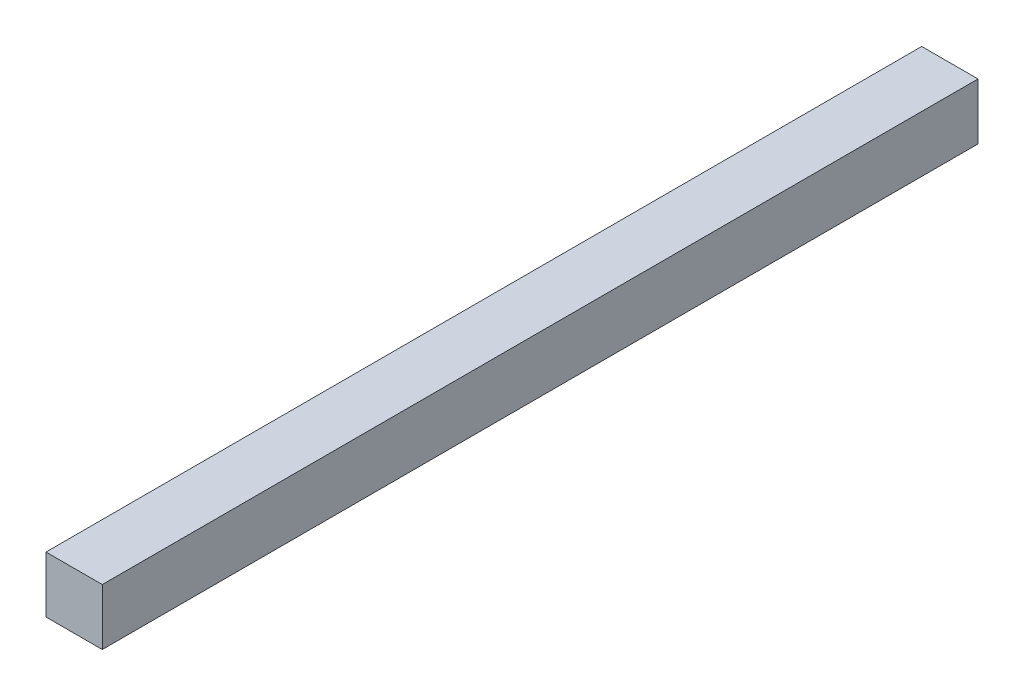
ISO-10303-21;
HEADER;
FILE_DESCRIPTION(('STEP AP214'),'2;1');
FILE_NAME('part.step','',(''),(''),'','','');
FILE_SCHEMA(('AUTOMOTIVE_DESIGN { 1 0 10303 214 1 1 1 1 }'));
ENDSEC;
DATA;
#1=APPLICATION_CONTEXT('core data for automotive mechanical design processes');
#2=APPLICATION_PROTOCOL_DEFINITION('international standard','automotive_design',2000,#1);
#3=PRODUCT_CONTEXT('',#1,'mechanical');
#4=PRODUCT('Part','Part','',(#3));
#5=PRODUCT_RELATED_PRODUCT_CATEGORY('part','',(#4));
#6=PRODUCT_DEFINITION_FORMATION('','',#4);
#7=PRODUCT_DEFINITION_CONTEXT('part definition',#1,'design');
#8=PRODUCT_DEFINITION('design','',#6,#7);
#9=PRODUCT_DEFINITION_SHAPE('','',#8);
#10=(LENGTH_UNIT() NAMED_UNIT(*) SI_UNIT(.MILLI.,.METRE.));
#11=(NAMED_UNIT(*) PLANE_ANGLE_UNIT() SI_UNIT($,.RADIAN.));
#12=(NAMED_UNIT(*) SI_UNIT($,.STERADIAN.) SOLID_ANGLE_UNIT());
#13=UNCERTAINTY_MEASURE_WITH_UNIT(LENGTH_MEASURE(1.E-05),#10,'distance_accuracy_value','');
#14=(GEOMETRIC_REPRESENTATION_CONTEXT(3) GLOBAL_UNCERTAINTY_ASSIGNED_CONTEXT((#13)) GLOBAL_UNIT_ASSIGNED_CONTEXT((#10,
#11,#12)) REPRESENTATION_CONTEXT('',''));
#15=CARTESIAN_POINT('',(0.,0.,0.));
#16=DIRECTION('',(0.,0.,1.));
#17=DIRECTION('',(1.,0.,0.));
#18=AXIS2_PLACEMENT_3D('',#15,#16,#17);
#19=CARTESIAN_POINT('',(-3.53553390593274,-3.53553390593274,110.));
#20=DIRECTION('',(1.,0.,0.));
#21=DIRECTION('',(0.,0.,-1.));
#22=AXIS2_PLACEMENT_3D('',#19,#20,#21);
#23=PLANE('',#22);
#24=DIRECTION('',(0.,-1.,0.));
#25=VECTOR('',#24,1.);
#26=CARTESIAN_POINT('',(-3.53553390593274,-3.53553390593274,0.));
#27=LINE('',#26,#25);
#28=CARTESIAN_POINT('',(-3.53553390593274,3.53553390593274,0.));
#29=VERTEX_POINT('',#28);
#30=CARTESIAN_POINT('',(-3.53553390593274,-3.53553390593274,0.));
#31=VERTEX_POINT('',#30);
#32=EDGE_CURVE('E96',#29,#31,#27,.T.);
#33=ORIENTED_EDGE('',*,*,#32,.T.);
#34=DIRECTION('',(0.,0.,-1.));
#35=VECTOR('',#34,1.);
#36=CARTESIAN_POINT('',(-3.53553390593274,-3.53553390593274,110.));
#37=LINE('',#36,#35);
#38=CARTESIAN_POINT('',(-3.53553390593274,-3.53553390593274,110.));
#39=VERTEX_POINT('',#38);
#40=EDGE_CURVE('E11',#39,#31,#37,.T.);
#41=ORIENTED_EDGE('',*,*,#40,.F.);
#42=DIRECTION('',(0.,-1.,0.));
#43=VECTOR('',#42,1.);
#44=CARTESIAN_POINT('',(-3.53553390593274,-3.53553390593274,110.));
#45=LINE('',#44,#43);
#46=CARTESIAN_POINT('',(-3.53553390593274,3.53553390593274,110.));
#47=VERTEX_POINT('',#46);
#48=EDGE_CURVE('E84',#47,#39,#45,.T.);
#49=ORIENTED_EDGE('',*,*,#48,.F.);
#50=DIRECTION('',(0.,0.,-1.));
#51=VECTOR('',#50,1.);
#52=CARTESIAN_POINT('',(-3.53553390593274,3.53553390593274,110.));
#53=LINE('',#52,#51);
#54=EDGE_CURVE('E92',#47,#29,#53,.T.);
#55=ORIENTED_EDGE('',*,*,#54,.T.);
#56=EDGE_LOOP('',(#33,#41,#49,#55));
#57=FACE_BOUND('',#56,.T.);
#58=ADVANCED_FACE('F33',(#57),#23,.F.);
#59=CARTESIAN_POINT('',(3.53553390593274,-3.53553390593274,110.));
#60=DIRECTION('',(0.,1.,0.));
#61=DIRECTION('',(-1.,0.,0.));
#62=AXIS2_PLACEMENT_3D('',#59,#60,#61);
#63=PLANE('',#62);
#64=DIRECTION('',(1.,0.,0.));
#65=VECTOR('',#64,1.);
#66=CARTESIAN_POINT('',(3.53553390593274,-3.53553390593274,0.));
#67=LINE('',#66,#65);
#68=CARTESIAN_POINT('',(3.53553390593274,-3.53553390593274,0.));
#69=VERTEX_POINT('',#68);
#70=EDGE_CURVE('E88',#31,#69,#67,.T.);
#71=ORIENTED_EDGE('',*,*,#70,.T.);
#72=DIRECTION('',(0.,0.,-1.));
#73=VECTOR('',#72,1.);
#74=CARTESIAN_POINT('',(3.53553390593274,-3.53553390593274,110.));
#75=LINE('',#74,#73);
#76=CARTESIAN_POINT('',(3.53553390593274,-3.53553390593274,110.));
#77=VERTEX_POINT('',#76);
#78=EDGE_CURVE('E41',#77,#69,#75,.T.);
#79=ORIENTED_EDGE('',*,*,#78,.F.);
#80=DIRECTION('',(1.,0.,0.));
#81=VECTOR('',#80,1.);
#82=CARTESIAN_POINT('',(3.53553390593274,-3.53553390593274,110.));
#83=LINE('',#82,#81);
#84=EDGE_CURVE('E79',#39,#77,#83,.T.);
#85=ORIENTED_EDGE('',*,*,#84,.F.);
#86=ORIENTED_EDGE('',*,*,#40,.T.);
#87=EDGE_LOOP('',(#71,#79,#85,#86));
#88=FACE_BOUND('',#87,.T.);
#89=ADVANCED_FACE('F87',(#88),#63,.F.);
#90=CARTESIAN_POINT('',(3.53553390593274,-3.53553390593274,110.));
#91=DIRECTION('',(-1.,0.,0.));
#92=DIRECTION('',(0.,-1.,0.));
#93=AXIS2_PLACEMENT_3D('',#90,#91,#92);
#94=PLANE('',#93);
#95=DIRECTION('',(0.,1.,0.));
#96=VECTOR('',#95,1.);
#97=CARTESIAN_POINT('',(3.53553390593274,-3.53553390593274,0.));
#98=LINE('',#97,#96);
#99=CARTESIAN_POINT('',(3.53553390593274,3.53553390593274,0.));
#100=VERTEX_POINT('',#99);
#101=EDGE_CURVE('E66',#69,#100,#98,.T.);
#102=ORIENTED_EDGE('',*,*,#101,.T.);
#103=DIRECTION('',(0.,0.,-1.));
#104=VECTOR('',#103,1.);
#105=CARTESIAN_POINT('',(3.53553390593274,3.53553390593274,110.));
#106=LINE('',#105,#104);
#107=CARTESIAN_POINT('',(3.53553390593274,3.53553390593274,110.));
#108=VERTEX_POINT('',#107);
#109=EDGE_CURVE('E89',#108,#100,#106,.T.);
#110=ORIENTED_EDGE('',*,*,#109,.F.);
#111=DIRECTION('',(0.,1.,0.));
#112=VECTOR('',#111,1.);
#113=CARTESIAN_POINT('',(3.53553390593274,-3.53553390593274,110.));
#114=LINE('',#113,#112);
#115=EDGE_CURVE('E82',#77,#108,#114,.T.);
#116=ORIENTED_EDGE('',*,*,#115,.F.);
#117=ORIENTED_EDGE('',*,*,#78,.T.);
#118=EDGE_LOOP('',(#102,#110,#116,#117));
#119=FACE_BOUND('',#118,.T.);
#120=ADVANCED_FACE('F90',(#119),#94,.F.);
#121=CARTESIAN_POINT('',(3.53553390593274,3.53553390593274,110.));
#122=DIRECTION('',(0.,-1.,0.));
#123=DIRECTION('',(1.,0.,0.));
#124=AXIS2_PLACEMENT_3D('',#121,#122,#123);
#125=PLANE('',#124);
#126=DIRECTION('',(-1.,0.,0.));
#127=VECTOR('',#126,1.);
#128=CARTESIAN_POINT('',(3.53553390593274,3.53553390593274,0.));
#129=LINE('',#128,#127);
#130=EDGE_CURVE('E72',#100,#29,#129,.T.);
#131=ORIENTED_EDGE('',*,*,#130,.T.);
#132=ORIENTED_EDGE('',*,*,#54,.F.);
#133=DIRECTION('',(-1.,0.,0.));
#134=VECTOR('',#133,1.);
#135=CARTESIAN_POINT('',(3.53553390593274,3.53553390593274,110.));
#136=LINE('',#135,#134);
#137=EDGE_CURVE('E49',#108,#47,#136,.T.);
#138=ORIENTED_EDGE('',*,*,#137,.F.);
#139=ORIENTED_EDGE('',*,*,#109,.T.);
#140=EDGE_LOOP('',(#131,#132,#138,#139));
#141=FACE_BOUND('',#140,.T.);
#142=ADVANCED_FACE('F103',(#141),#125,.F.);
#143=CARTESIAN_POINT('',(0.,0.,110.));
#144=DIRECTION('',(0.,0.,1.));
#145=DIRECTION('',(1.,0.,0.));
#146=AXIS2_PLACEMENT_3D('',#143,#144,#145);
#147=PLANE('',#146);
#148=ORIENTED_EDGE('',*,*,#48,.T.);
#149=ORIENTED_EDGE('',*,*,#84,.T.);
#150=ORIENTED_EDGE('',*,*,#115,.T.);
#151=ORIENTED_EDGE('',*,*,#137,.T.);
#152=EDGE_LOOP('',(#148,#149,#150,#151));
#153=FACE_BOUND('',#152,.T.);
#154=ADVANCED_FACE('F80',(#153),#147,.T.);
#155=CARTESIAN_POINT('',(0.,0.,0.));
#156=DIRECTION('',(0.,0.,1.));
#157=DIRECTION('',(1.,0.,0.));
#158=AXIS2_PLACEMENT_3D('',#155,#156,#157);
#159=PLANE('',#158);
#160=ORIENTED_EDGE('',*,*,#32,.F.);
#161=ORIENTED_EDGE('',*,*,#130,.F.);
#162=ORIENTED_EDGE('',*,*,#101,.F.);
#163=ORIENTED_EDGE('',*,*,#70,.F.);
#164=EDGE_LOOP('',(#160,#161,#162,#163));
#165=FACE_BOUND('',#164,.T.);
#166=ADVANCED_FACE('F106',(#165),#159,.F.);
#167=CLOSED_SHELL('',(#58,#89,#120,#142,#154,#166));
#168=MANIFOLD_SOLID_BREP('B2',#167);
#169=ADVANCED_BREP_SHAPE_REPRESENTATION('',(#18,#168),#14);
#170=SHAPE_DEFINITION_REPRESENTATION(#9,#169);
ENDSEC;
END-ISO-10303-21;
